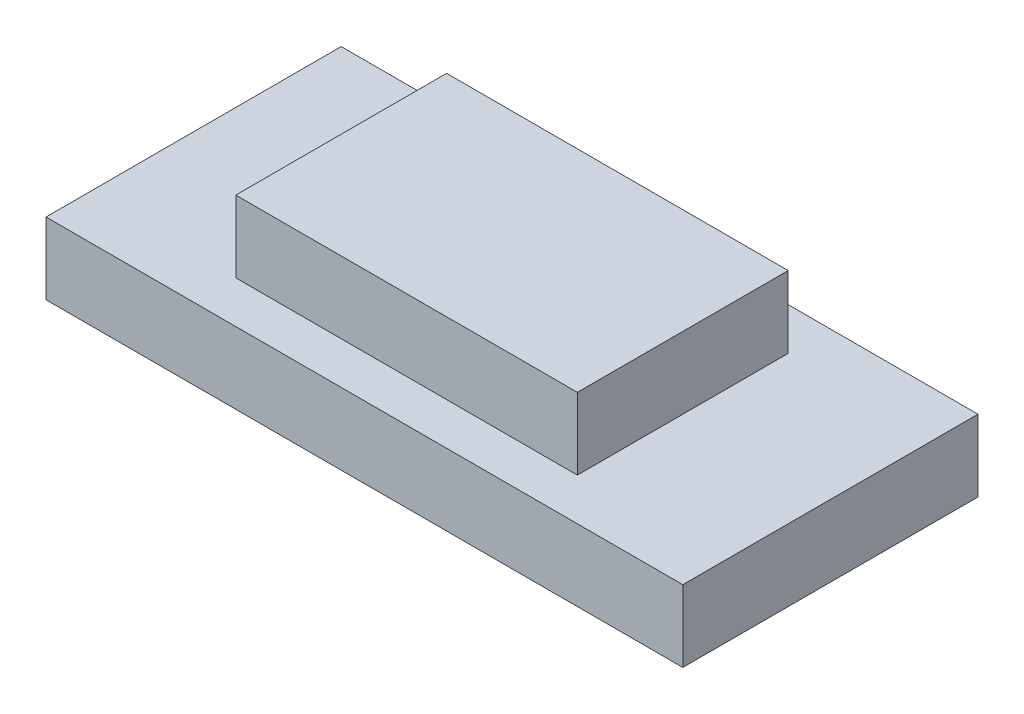
ISO-10303-21;
HEADER;
FILE_DESCRIPTION(('STEP AP214'),'2;1');
FILE_NAME('part.step','',(''),(''),'','','');
FILE_SCHEMA(('AUTOMOTIVE_DESIGN { 1 0 10303 214 1 1 1 1 }'));
ENDSEC;
DATA;
#1=APPLICATION_CONTEXT('core data for automotive mechanical design processes');
#2=APPLICATION_PROTOCOL_DEFINITION('international standard','automotive_design',2000,#1);
#3=PRODUCT_CONTEXT('',#1,'mechanical');
#4=PRODUCT('Part','Part','',(#3));
#5=PRODUCT_RELATED_PRODUCT_CATEGORY('part','',(#4));
#6=PRODUCT_DEFINITION_FORMATION('','',#4);
#7=PRODUCT_DEFINITION_CONTEXT('part definition',#1,'design');
#8=PRODUCT_DEFINITION('design','',#6,#7);
#9=PRODUCT_DEFINITION_SHAPE('','',#8);
#10=(LENGTH_UNIT() NAMED_UNIT(*) SI_UNIT(.MILLI.,.METRE.));
#11=(NAMED_UNIT(*) PLANE_ANGLE_UNIT() SI_UNIT($,.RADIAN.));
#12=(NAMED_UNIT(*) SI_UNIT($,.STERADIAN.) SOLID_ANGLE_UNIT());
#13=UNCERTAINTY_MEASURE_WITH_UNIT(LENGTH_MEASURE(1.E-05),#10,'distance_accuracy_value','');
#14=(GEOMETRIC_REPRESENTATION_CONTEXT(3) GLOBAL_UNCERTAINTY_ASSIGNED_CONTEXT((#13)) GLOBAL_UNIT_ASSIGNED_CONTEXT((#10,
#11,#12)) REPRESENTATION_CONTEXT('',''));
#15=CARTESIAN_POINT('',(0.,0.,0.));
#16=DIRECTION('',(0.,0.,1.));
#17=DIRECTION('',(1.,0.,0.));
#18=AXIS2_PLACEMENT_3D('',#15,#16,#17);
#19=CARTESIAN_POINT('',(0.,17.,0.));
#20=DIRECTION('',(1.,0.,0.));
#21=DIRECTION('',(0.,0.,-1.));
#22=AXIS2_PLACEMENT_3D('',#19,#20,#21);
#23=PLANE('',#22);
#24=DIRECTION('',(0.,0.,1.));
#25=VECTOR('',#24,1.);
#26=CARTESIAN_POINT('',(0.,0.,0.));
#27=LINE('',#26,#25);
#28=CARTESIAN_POINT('',(0.,0.,0.));
#29=VERTEX_POINT('',#28);
#30=CARTESIAN_POINT('',(0.,0.,70.));
#31=VERTEX_POINT('',#30);
#32=EDGE_CURVE('E121',#29,#31,#27,.T.);
#33=ORIENTED_EDGE('',*,*,#32,.T.);
#34=DIRECTION('',(0.,-1.,0.));
#35=VECTOR('',#34,1.);
#36=CARTESIAN_POINT('',(0.,17.,70.));
#37=LINE('',#36,#35);
#38=CARTESIAN_POINT('',(0.,17.,70.));
#39=VERTEX_POINT('',#38);
#40=EDGE_CURVE('E11',#39,#31,#37,.T.);
#41=ORIENTED_EDGE('',*,*,#40,.F.);
#42=DIRECTION('',(0.,0.,1.));
#43=VECTOR('',#42,1.);
#44=CARTESIAN_POINT('',(0.,17.,0.));
#45=LINE('',#44,#43);
#46=CARTESIAN_POINT('',(0.,17.,0.));
#47=VERTEX_POINT('',#46);
#48=EDGE_CURVE('E130',#47,#39,#45,.T.);
#49=ORIENTED_EDGE('',*,*,#48,.F.);
#50=DIRECTION('',(0.,-1.,0.));
#51=VECTOR('',#50,1.);
#52=CARTESIAN_POINT('',(0.,17.,0.));
#53=LINE('',#52,#51);
#54=EDGE_CURVE('E139',#47,#29,#53,.T.);
#55=ORIENTED_EDGE('',*,*,#54,.T.);
#56=EDGE_LOOP('',(#33,#41,#49,#55));
#57=FACE_BOUND('',#56,.T.);
#58=ADVANCED_FACE('F37',(#57),#23,.F.);
#59=CARTESIAN_POINT('',(0.,17.,70.));
#60=DIRECTION('',(0.,0.,-1.));
#61=DIRECTION('',(-1.,0.,0.));
#62=AXIS2_PLACEMENT_3D('',#59,#60,#61);
#63=PLANE('',#62);
#64=DIRECTION('',(1.,0.,0.));
#65=VECTOR('',#64,1.);
#66=CARTESIAN_POINT('',(0.,0.,70.));
#67=LINE('',#66,#65);
#68=CARTESIAN_POINT('',(151.,0.,70.));
#69=VERTEX_POINT('',#68);
#70=EDGE_CURVE('E124',#31,#69,#67,.T.);
#71=ORIENTED_EDGE('',*,*,#70,.T.);
#72=DIRECTION('',(0.,-1.,0.));
#73=VECTOR('',#72,1.);
#74=CARTESIAN_POINT('',(151.,17.,70.));
#75=LINE('',#74,#73);
#76=CARTESIAN_POINT('',(151.,17.,70.));
#77=VERTEX_POINT('',#76);
#78=EDGE_CURVE('E44',#77,#69,#75,.T.);
#79=ORIENTED_EDGE('',*,*,#78,.F.);
#80=DIRECTION('',(1.,0.,0.));
#81=VECTOR('',#80,1.);
#82=CARTESIAN_POINT('',(0.,17.,70.));
#83=LINE('',#82,#81);
#84=EDGE_CURVE('E133',#39,#77,#83,.T.);
#85=ORIENTED_EDGE('',*,*,#84,.F.);
#86=ORIENTED_EDGE('',*,*,#40,.T.);
#87=EDGE_LOOP('',(#71,#79,#85,#86));
#88=FACE_BOUND('',#87,.T.);
#89=ADVANCED_FACE('F170',(#88),#63,.F.);
#90=CARTESIAN_POINT('',(151.,17.,0.));
#91=DIRECTION('',(-1.,0.,0.));
#92=DIRECTION('',(0.,0.,1.));
#93=AXIS2_PLACEMENT_3D('',#90,#91,#92);
#94=PLANE('',#93);
#95=DIRECTION('',(0.,0.,-1.));
#96=VECTOR('',#95,1.);
#97=CARTESIAN_POINT('',(151.,0.,0.));
#98=LINE('',#97,#96);
#99=CARTESIAN_POINT('',(151.,0.,0.));
#100=VERTEX_POINT('',#99);
#101=EDGE_CURVE('E142',#69,#100,#98,.T.);
#102=ORIENTED_EDGE('',*,*,#101,.T.);
#103=DIRECTION('',(0.,-1.,0.));
#104=VECTOR('',#103,1.);
#105=CARTESIAN_POINT('',(151.,17.,0.));
#106=LINE('',#105,#104);
#107=CARTESIAN_POINT('',(151.,17.,0.));
#108=VERTEX_POINT('',#107);
#109=EDGE_CURVE('E147',#108,#100,#106,.T.);
#110=ORIENTED_EDGE('',*,*,#109,.F.);
#111=DIRECTION('',(0.,0.,-1.));
#112=VECTOR('',#111,1.);
#113=CARTESIAN_POINT('',(151.,17.,0.));
#114=LINE('',#113,#112);
#115=EDGE_CURVE('E136',#77,#108,#114,.T.);
#116=ORIENTED_EDGE('',*,*,#115,.F.);
#117=ORIENTED_EDGE('',*,*,#78,.T.);
#118=EDGE_LOOP('',(#102,#110,#116,#117));
#119=FACE_BOUND('',#118,.T.);
#120=ADVANCED_FACE('F154',(#119),#94,.F.);
#121=CARTESIAN_POINT('',(0.,17.,0.));
#122=DIRECTION('',(0.,0.,1.));
#123=DIRECTION('',(1.,0.,0.));
#124=AXIS2_PLACEMENT_3D('',#121,#122,#123);
#125=PLANE('',#124);
#126=DIRECTION('',(-1.,0.,0.));
#127=VECTOR('',#126,1.);
#128=CARTESIAN_POINT('',(0.,0.,0.));
#129=LINE('',#128,#127);
#130=EDGE_CURVE('E134',#100,#29,#129,.T.);
#131=ORIENTED_EDGE('',*,*,#130,.T.);
#132=ORIENTED_EDGE('',*,*,#54,.F.);
#133=DIRECTION('',(-1.,0.,0.));
#134=VECTOR('',#133,1.);
#135=CARTESIAN_POINT('',(0.,17.,0.));
#136=LINE('',#135,#134);
#137=EDGE_CURVE('E138',#108,#47,#136,.T.);
#138=ORIENTED_EDGE('',*,*,#137,.F.);
#139=ORIENTED_EDGE('',*,*,#109,.T.);
#140=EDGE_LOOP('',(#131,#132,#138,#139));
#141=FACE_BOUND('',#140,.T.);
#142=ADVANCED_FACE('F163',(#141),#125,.F.);
#143=CARTESIAN_POINT('',(0.,17.,0.));
#144=DIRECTION('',(0.,1.,0.));
#145=DIRECTION('',(0.,0.,1.));
#146=AXIS2_PLACEMENT_3D('',#143,#144,#145);
#147=PLANE('',#146);
#148=DIRECTION('',(0.,0.,1.));
#149=VECTOR('',#148,1.);
#150=CARTESIAN_POINT('',(35.,17.,10.));
#151=LINE('',#150,#149);
#152=CARTESIAN_POINT('',(35.,17.,10.));
#153=VERTEX_POINT('',#152);
#154=CARTESIAN_POINT('',(35.,17.,60.));
#155=VERTEX_POINT('',#154);
#156=EDGE_CURVE('E51',#153,#155,#151,.T.);
#157=ORIENTED_EDGE('',*,*,#156,.F.);
#158=DIRECTION('',(-1.,0.,0.));
#159=VECTOR('',#158,1.);
#160=CARTESIAN_POINT('',(35.,17.,10.));
#161=LINE('',#160,#159);
#162=CARTESIAN_POINT('',(116.,17.,10.));
#163=VERTEX_POINT('',#162);
#164=EDGE_CURVE('E55',#163,#153,#161,.T.);
#165=ORIENTED_EDGE('',*,*,#164,.F.);
#166=DIRECTION('',(0.,0.,-1.));
#167=VECTOR('',#166,1.);
#168=CARTESIAN_POINT('',(116.,17.,10.));
#169=LINE('',#168,#167);
#170=CARTESIAN_POINT('',(116.,17.,60.));
#171=VERTEX_POINT('',#170);
#172=EDGE_CURVE('E286',#171,#163,#169,.T.);
#173=ORIENTED_EDGE('',*,*,#172,.F.);
#174=DIRECTION('',(1.,0.,0.));
#175=VECTOR('',#174,1.);
#176=CARTESIAN_POINT('',(35.,17.,60.));
#177=LINE('',#176,#175);
#178=EDGE_CURVE('E292',#155,#171,#177,.T.);
#179=ORIENTED_EDGE('',*,*,#178,.F.);
#180=EDGE_LOOP('',(#157,#165,#173,#179));
#181=FACE_BOUND('',#180,.T.);
#182=ORIENTED_EDGE('',*,*,#48,.T.);
#183=ORIENTED_EDGE('',*,*,#84,.T.);
#184=ORIENTED_EDGE('',*,*,#115,.T.);
#185=ORIENTED_EDGE('',*,*,#137,.T.);
#186=EDGE_LOOP('',(#182,#183,#184,#185));
#187=FACE_BOUND('',#186,.T.);
#188=ADVANCED_FACE('F169',(#181,#187),#147,.T.);
#189=CARTESIAN_POINT('',(0.,0.,0.));
#190=DIRECTION('',(0.,1.,0.));
#191=DIRECTION('',(0.,0.,1.));
#192=AXIS2_PLACEMENT_3D('',#189,#190,#191);
#193=PLANE('',#192);
#194=ORIENTED_EDGE('',*,*,#32,.F.);
#195=ORIENTED_EDGE('',*,*,#130,.F.);
#196=ORIENTED_EDGE('',*,*,#101,.F.);
#197=ORIENTED_EDGE('',*,*,#70,.F.);
#198=EDGE_LOOP('',(#194,#195,#196,#197));
#199=FACE_BOUND('',#198,.T.);
#200=ADVANCED_FACE('F160',(#199),#193,.F.);
#201=CARTESIAN_POINT('',(35.,34.,10.));
#202=DIRECTION('',(1.,0.,0.));
#203=DIRECTION('',(0.,0.,-1.));
#204=AXIS2_PLACEMENT_3D('',#201,#202,#203);
#205=PLANE('',#204);
#206=ORIENTED_EDGE('',*,*,#156,.T.);
#207=DIRECTION('',(0.,-1.,0.));
#208=VECTOR('',#207,1.);
#209=CARTESIAN_POINT('',(35.,34.,60.));
#210=LINE('',#209,#208);
#211=CARTESIAN_POINT('',(35.,34.,60.));
#212=VERTEX_POINT('',#211);
#213=EDGE_CURVE('E104',#212,#155,#210,.T.);
#214=ORIENTED_EDGE('',*,*,#213,.F.);
#215=DIRECTION('',(0.,0.,1.));
#216=VECTOR('',#215,1.);
#217=CARTESIAN_POINT('',(35.,34.,10.));
#218=LINE('',#217,#216);
#219=CARTESIAN_POINT('',(35.,34.,10.));
#220=VERTEX_POINT('',#219);
#221=EDGE_CURVE('E110',#220,#212,#218,.T.);
#222=ORIENTED_EDGE('',*,*,#221,.F.);
#223=DIRECTION('',(0.,-1.,0.));
#224=VECTOR('',#223,1.);
#225=CARTESIAN_POINT('',(35.,34.,10.));
#226=LINE('',#225,#224);
#227=EDGE_CURVE('E284',#220,#153,#226,.T.);
#228=ORIENTED_EDGE('',*,*,#227,.T.);
#229=EDGE_LOOP('',(#206,#214,#222,#228));
#230=FACE_BOUND('',#229,.T.);
#231=ADVANCED_FACE('F120',(#230),#205,.F.);
#232=CARTESIAN_POINT('',(35.,34.,60.));
#233=DIRECTION('',(0.,0.,-1.));
#234=DIRECTION('',(-1.,0.,0.));
#235=AXIS2_PLACEMENT_3D('',#232,#233,#234);
#236=PLANE('',#235);
#237=ORIENTED_EDGE('',*,*,#178,.T.);
#238=DIRECTION('',(0.,-1.,0.));
#239=VECTOR('',#238,1.);
#240=CARTESIAN_POINT('',(116.,34.,60.));
#241=LINE('',#240,#239);
#242=CARTESIAN_POINT('',(116.,34.,60.));
#243=VERTEX_POINT('',#242);
#244=EDGE_CURVE('E106',#243,#171,#241,.T.);
#245=ORIENTED_EDGE('',*,*,#244,.F.);
#246=DIRECTION('',(1.,0.,0.));
#247=VECTOR('',#246,1.);
#248=CARTESIAN_POINT('',(35.,34.,60.));
#249=LINE('',#248,#247);
#250=EDGE_CURVE('E99',#212,#243,#249,.T.);
#251=ORIENTED_EDGE('',*,*,#250,.F.);
#252=ORIENTED_EDGE('',*,*,#213,.T.);
#253=EDGE_LOOP('',(#237,#245,#251,#252));
#254=FACE_BOUND('',#253,.T.);
#255=ADVANCED_FACE('F102',(#254),#236,.F.);
#256=CARTESIAN_POINT('',(116.,34.,10.));
#257=DIRECTION('',(-1.,0.,0.));
#258=DIRECTION('',(0.,0.,1.));
#259=AXIS2_PLACEMENT_3D('',#256,#257,#258);
#260=PLANE('',#259);
#261=ORIENTED_EDGE('',*,*,#172,.T.);
#262=DIRECTION('',(0.,-1.,0.));
#263=VECTOR('',#262,1.);
#264=CARTESIAN_POINT('',(116.,34.,10.));
#265=LINE('',#264,#263);
#266=CARTESIAN_POINT('',(116.,34.,10.));
#267=VERTEX_POINT('',#266);
#268=EDGE_CURVE('E126',#267,#163,#265,.T.);
#269=ORIENTED_EDGE('',*,*,#268,.F.);
#270=DIRECTION('',(0.,0.,-1.));
#271=VECTOR('',#270,1.);
#272=CARTESIAN_POINT('',(116.,34.,10.));
#273=LINE('',#272,#271);
#274=EDGE_CURVE('E109',#243,#267,#273,.T.);
#275=ORIENTED_EDGE('',*,*,#274,.F.);
#276=ORIENTED_EDGE('',*,*,#244,.T.);
#277=EDGE_LOOP('',(#261,#269,#275,#276));
#278=FACE_BOUND('',#277,.T.);
#279=ADVANCED_FACE('F188',(#278),#260,.F.);
#280=CARTESIAN_POINT('',(35.,34.,10.));
#281=DIRECTION('',(0.,0.,1.));
#282=DIRECTION('',(1.,0.,0.));
#283=AXIS2_PLACEMENT_3D('',#280,#281,#282);
#284=PLANE('',#283);
#285=ORIENTED_EDGE('',*,*,#164,.T.);
#286=ORIENTED_EDGE('',*,*,#227,.F.);
#287=DIRECTION('',(-1.,0.,0.));
#288=VECTOR('',#287,1.);
#289=CARTESIAN_POINT('',(35.,34.,10.));
#290=LINE('',#289,#288);
#291=EDGE_CURVE('E115',#267,#220,#290,.T.);
#292=ORIENTED_EDGE('',*,*,#291,.F.);
#293=ORIENTED_EDGE('',*,*,#268,.T.);
#294=EDGE_LOOP('',(#285,#286,#292,#293));
#295=FACE_BOUND('',#294,.T.);
#296=ADVANCED_FACE('F191',(#295),#284,.F.);
#297=CARTESIAN_POINT('',(0.,34.,0.));
#298=DIRECTION('',(0.,1.,0.));
#299=DIRECTION('',(0.,0.,1.));
#300=AXIS2_PLACEMENT_3D('',#297,#298,#299);
#301=PLANE('',#300);
#302=ORIENTED_EDGE('',*,*,#221,.T.);
#303=ORIENTED_EDGE('',*,*,#250,.T.);
#304=ORIENTED_EDGE('',*,*,#274,.T.);
#305=ORIENTED_EDGE('',*,*,#291,.T.);
#306=EDGE_LOOP('',(#302,#303,#304,#305));
#307=FACE_BOUND('',#306,.T.);
#308=ADVANCED_FACE('F113',(#307),#301,.T.);
#309=CLOSED_SHELL('',(#58,#89,#120,#142,#188,#200,#231,#255,#279,#296,#308));
#310=MANIFOLD_SOLID_BREP('B2',#309);
#311=ADVANCED_BREP_SHAPE_REPRESENTATION('',(#18,#310),#14);
#312=SHAPE_DEFINITION_REPRESENTATION(#9,#311);
ENDSEC;
END-ISO-10303-21;
